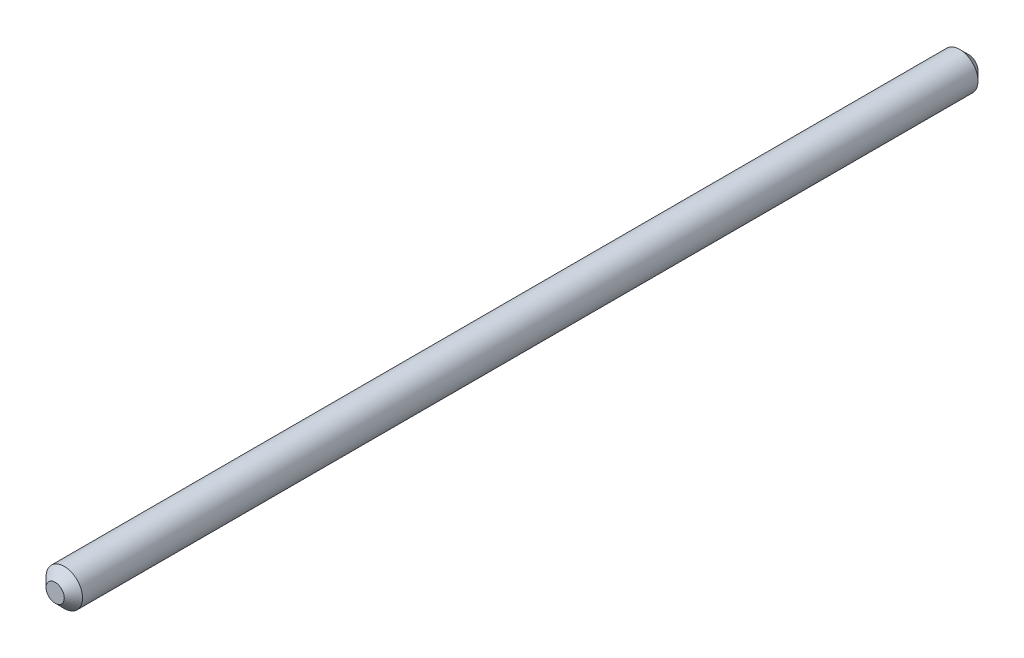
ISO-10303-21;
HEADER;
FILE_DESCRIPTION(('STEP AP214'),'2;1');
FILE_NAME('part.step','',(''),(''),'','','');
FILE_SCHEMA(('AUTOMOTIVE_DESIGN { 1 0 10303 214 1 1 1 1 }'));
ENDSEC;
DATA;
#1=APPLICATION_CONTEXT('core data for automotive mechanical design processes');
#2=APPLICATION_PROTOCOL_DEFINITION('international standard','automotive_design',2000,#1);
#3=PRODUCT_CONTEXT('',#1,'mechanical');
#4=PRODUCT('Part','Part','',(#3));
#5=PRODUCT_RELATED_PRODUCT_CATEGORY('part','',(#4));
#6=PRODUCT_DEFINITION_FORMATION('','',#4);
#7=PRODUCT_DEFINITION_CONTEXT('part definition',#1,'design');
#8=PRODUCT_DEFINITION('design','',#6,#7);
#9=PRODUCT_DEFINITION_SHAPE('','',#8);
#10=(LENGTH_UNIT() NAMED_UNIT(*) SI_UNIT(.MILLI.,.METRE.));
#11=(NAMED_UNIT(*) PLANE_ANGLE_UNIT() SI_UNIT($,.RADIAN.));
#12=(NAMED_UNIT(*) SI_UNIT($,.STERADIAN.) SOLID_ANGLE_UNIT());
#13=UNCERTAINTY_MEASURE_WITH_UNIT(LENGTH_MEASURE(1.E-05),#10,'distance_accuracy_value','');
#14=(GEOMETRIC_REPRESENTATION_CONTEXT(3) GLOBAL_UNCERTAINTY_ASSIGNED_CONTEXT((#13)) GLOBAL_UNIT_ASSIGNED_CONTEXT((#10,
#11,#12)) REPRESENTATION_CONTEXT('',''));
#15=CARTESIAN_POINT('',(0.,0.,0.));
#16=DIRECTION('',(0.,0.,1.));
#17=DIRECTION('',(1.,0.,0.));
#18=AXIS2_PLACEMENT_3D('',#15,#16,#17);
#19=CARTESIAN_POINT('',(0.,0.,50.));
#20=DIRECTION('',(0.,0.,-1.));
#21=DIRECTION('',(-1.,0.,0.));
#22=AXIS2_PLACEMENT_3D('',#19,#20,#21);
#23=CYLINDRICAL_SURFACE('',#22,1.);
#24=CARTESIAN_POINT('',(0.,0.,0.499999999999994));
#25=DIRECTION('',(0.,0.,1.));
#26=DIRECTION('',(1.,0.,0.));
#27=AXIS2_PLACEMENT_3D('',#24,#25,#26);
#28=CIRCLE('',#27,1.);
#29=CARTESIAN_POINT('',(1.,0.,0.499999999999994));
#30=VERTEX_POINT('',#29);
#31=EDGE_CURVE('E50',#30,#30,#28,.T.);
#32=ORIENTED_EDGE('',*,*,#31,.T.);
#33=EDGE_LOOP('',(#32));
#34=FACE_BOUND('',#33,.T.);
#35=CARTESIAN_POINT('',(0.,0.,49.5));
#36=DIRECTION('',(0.,0.,1.));
#37=DIRECTION('',(1.,0.,0.));
#38=AXIS2_PLACEMENT_3D('',#35,#36,#37);
#39=CIRCLE('',#38,1.);
#40=CARTESIAN_POINT('',(1.,0.,49.5));
#41=VERTEX_POINT('',#40);
#42=EDGE_CURVE('E55',#41,#41,#39,.F.);
#43=ORIENTED_EDGE('',*,*,#42,.T.);
#44=EDGE_LOOP('',(#43));
#45=FACE_BOUND('',#44,.T.);
#46=ADVANCED_FACE('F37',(#34,#45),#23,.T.);
#47=CARTESIAN_POINT('',(0.,0.,50.));
#48=DIRECTION('',(0.,0.,1.));
#49=DIRECTION('',(1.,0.,0.));
#50=AXIS2_PLACEMENT_3D('',#47,#48,#49);
#51=PLANE('',#50);
#52=CARTESIAN_POINT('',(0.,0.,50.));
#53=DIRECTION('',(0.,0.,1.));
#54=DIRECTION('',(1.,0.,0.));
#55=AXIS2_PLACEMENT_3D('',#52,#53,#54);
#56=CIRCLE('',#55,0.5);
#57=CARTESIAN_POINT('',(0.5,0.,50.));
#58=VERTEX_POINT('',#57);
#59=EDGE_CURVE('E10',#58,#58,#56,.T.);
#60=ORIENTED_EDGE('',*,*,#59,.T.);
#61=EDGE_LOOP('',(#60));
#62=FACE_BOUND('',#61,.T.);
#63=ADVANCED_FACE('F72',(#62),#51,.T.);
#64=CARTESIAN_POINT('',(0.,0.,0.));
#65=DIRECTION('',(0.,0.,1.));
#66=DIRECTION('',(1.,0.,0.));
#67=AXIS2_PLACEMENT_3D('',#64,#65,#66);
#68=PLANE('',#67);
#69=CARTESIAN_POINT('',(0.,0.,0.));
#70=DIRECTION('',(0.,0.,1.));
#71=DIRECTION('',(1.,0.,0.));
#72=AXIS2_PLACEMENT_3D('',#69,#70,#71);
#73=CIRCLE('',#72,0.5);
#74=CARTESIAN_POINT('',(0.5,0.,0.));
#75=VERTEX_POINT('',#74);
#76=EDGE_CURVE('E45',#75,#75,#73,.F.);
#77=ORIENTED_EDGE('',*,*,#76,.T.);
#78=EDGE_LOOP('',(#77));
#79=FACE_BOUND('',#78,.T.);
#80=ADVANCED_FACE('F69',(#79),#68,.F.);
#81=CARTESIAN_POINT('',(0.,0.,0.499999999999994));
#82=DIRECTION('',(0.,0.,1.));
#83=DIRECTION('',(1.,0.,0.));
#84=AXIS2_PLACEMENT_3D('',#81,#82,#83);
#85=CONICAL_SURFACE('',#84,1.,0.785398163397454);
#86=ORIENTED_EDGE('',*,*,#76,.F.);
#87=EDGE_LOOP('',(#86));
#88=FACE_BOUND('',#87,.T.);
#89=ORIENTED_EDGE('',*,*,#31,.F.);
#90=EDGE_LOOP('',(#89));
#91=FACE_BOUND('',#90,.T.);
#92=ADVANCED_FACE('F65',(#88,#91),#85,.T.);
#93=CARTESIAN_POINT('',(0.,0.,50.));
#94=DIRECTION('',(0.,0.,-1.));
#95=DIRECTION('',(-1.,0.,0.));
#96=AXIS2_PLACEMENT_3D('',#93,#94,#95);
#97=CONICAL_SURFACE('',#96,0.5,0.785398163397454);
#98=ORIENTED_EDGE('',*,*,#42,.F.);
#99=EDGE_LOOP('',(#98));
#100=FACE_BOUND('',#99,.T.);
#101=ORIENTED_EDGE('',*,*,#59,.F.);
#102=EDGE_LOOP('',(#101));
#103=FACE_BOUND('',#102,.T.);
#104=ADVANCED_FACE('F39',(#100,#103),#97,.T.);
#105=CLOSED_SHELL('',(#46,#63,#80,#92,#104));
#106=MANIFOLD_SOLID_BREP('B2',#105);
#107=ADVANCED_BREP_SHAPE_REPRESENTATION('',(#18,#106),#14);
#108=SHAPE_DEFINITION_REPRESENTATION(#9,#107);
ENDSEC;
END-ISO-10303-21;
